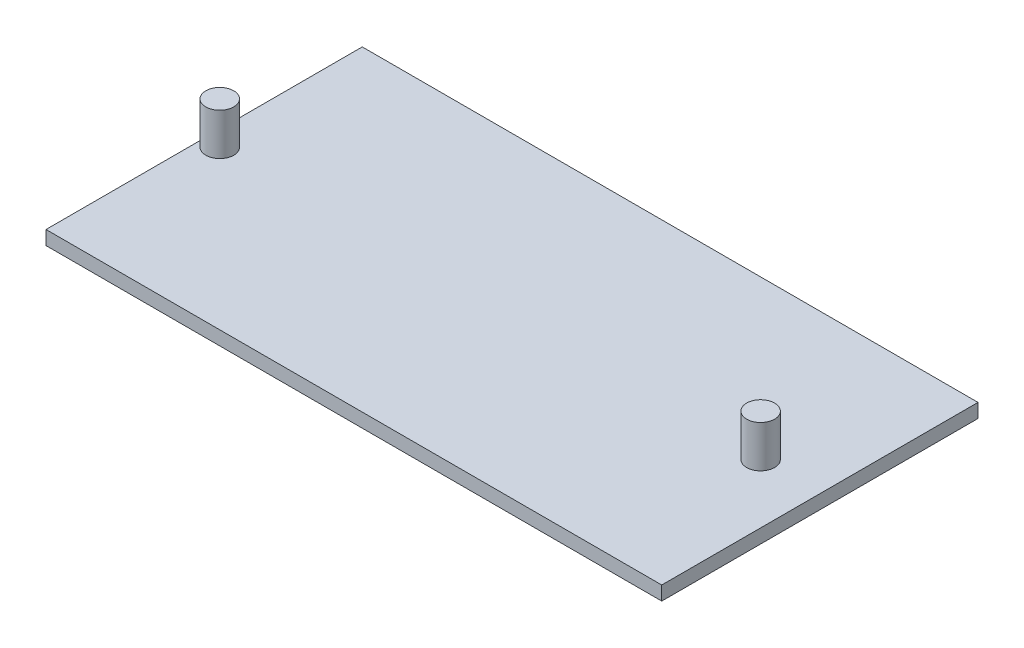
ISO-10303-21;
HEADER;
FILE_DESCRIPTION(('STEP AP214'),'2;1');
FILE_NAME('part.step','',(''),(''),'','','');
FILE_SCHEMA(('AUTOMOTIVE_DESIGN { 1 0 10303 214 1 1 1 1 }'));
ENDSEC;
DATA;
#1=APPLICATION_CONTEXT('core data for automotive mechanical design processes');
#2=APPLICATION_PROTOCOL_DEFINITION('international standard','automotive_design',2000,#1);
#3=PRODUCT_CONTEXT('',#1,'mechanical');
#4=PRODUCT('Part','Part','',(#3));
#5=PRODUCT_RELATED_PRODUCT_CATEGORY('part','',(#4));
#6=PRODUCT_DEFINITION_FORMATION('','',#4);
#7=PRODUCT_DEFINITION_CONTEXT('part definition',#1,'design');
#8=PRODUCT_DEFINITION('design','',#6,#7);
#9=PRODUCT_DEFINITION_SHAPE('','',#8);
#10=(LENGTH_UNIT() NAMED_UNIT(*) SI_UNIT(.MILLI.,.METRE.));
#11=(NAMED_UNIT(*) PLANE_ANGLE_UNIT() SI_UNIT($,.RADIAN.));
#12=(NAMED_UNIT(*) SI_UNIT($,.STERADIAN.) SOLID_ANGLE_UNIT());
#13=UNCERTAINTY_MEASURE_WITH_UNIT(LENGTH_MEASURE(1.E-05),#10,'distance_accuracy_value','');
#14=(GEOMETRIC_REPRESENTATION_CONTEXT(3) GLOBAL_UNCERTAINTY_ASSIGNED_CONTEXT((#13)) GLOBAL_UNIT_ASSIGNED_CONTEXT((#10,
#11,#12)) REPRESENTATION_CONTEXT('',''));
#15=CARTESIAN_POINT('',(0.,0.,0.));
#16=DIRECTION('',(0.,0.,1.));
#17=DIRECTION('',(1.,0.,0.));
#18=AXIS2_PLACEMENT_3D('',#15,#16,#17);
#19=CARTESIAN_POINT('',(6.35,9.525,-35.941));
#20=DIRECTION('',(0.,-1.,0.));
#21=DIRECTION('',(0.,0.,-1.));
#22=AXIS2_PLACEMENT_3D('',#19,#20,#21);
#23=CYLINDRICAL_SURFACE('',#22,3.175);
#24=CARTESIAN_POINT('',(6.35,9.525,-35.941));
#25=DIRECTION('',(0.,-1.,0.));
#26=DIRECTION('',(0.,0.,-1.));
#27=AXIS2_PLACEMENT_3D('',#24,#25,#26);
#28=CIRCLE('',#27,3.175);
#29=CARTESIAN_POINT('',(6.35,9.525,-39.116));
#30=VERTEX_POINT('',#29);
#31=EDGE_CURVE('E11',#30,#30,#28,.T.);
#32=ORIENTED_EDGE('',*,*,#31,.T.);
#33=EDGE_LOOP('',(#32));
#34=FACE_BOUND('',#33,.T.);
#35=CARTESIAN_POINT('',(6.35,0.,-35.941));
#36=DIRECTION('',(0.,-1.,0.));
#37=DIRECTION('',(0.,0.,-1.));
#38=AXIS2_PLACEMENT_3D('',#35,#36,#37);
#39=CIRCLE('',#38,3.175);
#40=CARTESIAN_POINT('',(6.35,0.,-39.116));
#41=VERTEX_POINT('',#40);
#42=EDGE_CURVE('E42',#41,#41,#39,.F.);
#43=ORIENTED_EDGE('',*,*,#42,.T.);
#44=EDGE_LOOP('',(#43));
#45=FACE_BOUND('',#44,.T.);
#46=ADVANCED_FACE('F39',(#34,#45),#23,.T.);
#47=CARTESIAN_POINT('',(6.35,9.525,-35.941));
#48=DIRECTION('',(0.,-1.,0.));
#49=DIRECTION('',(0.,0.,-1.));
#50=AXIS2_PLACEMENT_3D('',#47,#48,#49);
#51=PLANE('',#50);
#52=ORIENTED_EDGE('',*,*,#31,.F.);
#53=EDGE_LOOP('',(#52));
#54=FACE_BOUND('',#53,.T.);
#55=ADVANCED_FACE('F156',(#54),#51,.F.);
#56=CARTESIAN_POINT('',(6.35,0.,-35.941));
#57=DIRECTION('',(0.,-1.,0.));
#58=DIRECTION('',(0.,0.,-1.));
#59=AXIS2_PLACEMENT_3D('',#56,#57,#58);
#60=PLANE('',#59);
#61=ORIENTED_EDGE('',*,*,#42,.F.);
#62=EDGE_LOOP('',(#61));
#63=FACE_BOUND('',#62,.T.);
#64=CARTESIAN_POINT('',(129.286,0.,-35.941));
#65=DIRECTION('',(0.,-1.,0.));
#66=DIRECTION('',(0.,0.,-1.));
#67=AXIS2_PLACEMENT_3D('',#64,#65,#66);
#68=CIRCLE('',#67,3.175);
#69=CARTESIAN_POINT('',(129.286,0.,-39.116));
#70=VERTEX_POINT('',#69);
#71=EDGE_CURVE('E124',#70,#70,#68,.T.);
#72=ORIENTED_EDGE('',*,*,#71,.T.);
#73=EDGE_LOOP('',(#72));
#74=FACE_BOUND('',#73,.T.);
#75=DIRECTION('',(-1.,0.,0.));
#76=VECTOR('',#75,1.);
#77=CARTESIAN_POINT('',(0.,0.,-71.882));
#78=LINE('',#77,#76);
#79=CARTESIAN_POINT('',(142.748,0.,-71.882));
#80=VERTEX_POINT('',#79);
#81=CARTESIAN_POINT('',(2.794,0.,-71.882));
#82=VERTEX_POINT('',#81);
#83=EDGE_CURVE('E89',#80,#82,#78,.T.);
#84=ORIENTED_EDGE('',*,*,#83,.T.);
#85=DIRECTION('',(0.,0.,-1.));
#86=VECTOR('',#85,1.);
#87=CARTESIAN_POINT('',(2.794,0.,-71.882));
#88=LINE('',#87,#86);
#89=CARTESIAN_POINT('',(2.794,0.,0.));
#90=VERTEX_POINT('',#89);
#91=EDGE_CURVE('E59',#90,#82,#88,.T.);
#92=ORIENTED_EDGE('',*,*,#91,.F.);
#93=DIRECTION('',(1.,0.,0.));
#94=VECTOR('',#93,1.);
#95=CARTESIAN_POINT('',(0.,0.,0.));
#96=LINE('',#95,#94);
#97=CARTESIAN_POINT('',(142.748,0.,0.));
#98=VERTEX_POINT('',#97);
#99=EDGE_CURVE('E128',#90,#98,#96,.T.);
#100=ORIENTED_EDGE('',*,*,#99,.T.);
#101=DIRECTION('',(0.,0.,1.));
#102=VECTOR('',#101,1.);
#103=CARTESIAN_POINT('',(142.748,0.,0.));
#104=LINE('',#103,#102);
#105=EDGE_CURVE('E104',#80,#98,#104,.T.);
#106=ORIENTED_EDGE('',*,*,#105,.F.);
#107=EDGE_LOOP('',(#84,#92,#100,#106));
#108=FACE_BOUND('',#107,.T.);
#109=ADVANCED_FACE('F138',(#63,#74,#108),#60,.F.);
#110=CARTESIAN_POINT('',(0.,-3.175,-71.882));
#111=DIRECTION('',(0.,0.,-1.));
#112=DIRECTION('',(-1.,0.,0.));
#113=AXIS2_PLACEMENT_3D('',#110,#111,#112);
#114=PLANE('',#113);
#115=DIRECTION('',(0.,-1.,0.));
#116=VECTOR('',#115,1.);
#117=CARTESIAN_POINT('',(2.794,-3.175,-71.882));
#118=LINE('',#117,#116);
#119=CARTESIAN_POINT('',(2.794,-3.175,-71.882));
#120=VERTEX_POINT('',#119);
#121=EDGE_CURVE('E54',#82,#120,#118,.T.);
#122=ORIENTED_EDGE('',*,*,#121,.F.);
#123=ORIENTED_EDGE('',*,*,#83,.F.);
#124=DIRECTION('',(0.,1.,0.));
#125=VECTOR('',#124,1.);
#126=CARTESIAN_POINT('',(142.748,-3.175,-71.882));
#127=LINE('',#126,#125);
#128=CARTESIAN_POINT('',(142.748,-3.175,-71.882));
#129=VERTEX_POINT('',#128);
#130=EDGE_CURVE('E99',#129,#80,#127,.T.);
#131=ORIENTED_EDGE('',*,*,#130,.F.);
#132=DIRECTION('',(-1.,0.,0.));
#133=VECTOR('',#132,1.);
#134=CARTESIAN_POINT('',(0.,-3.175,-71.882));
#135=LINE('',#134,#133);
#136=EDGE_CURVE('E88',#129,#120,#135,.T.);
#137=ORIENTED_EDGE('',*,*,#136,.T.);
#138=EDGE_LOOP('',(#122,#123,#131,#137));
#139=FACE_BOUND('',#138,.T.);
#140=ADVANCED_FACE('F152',(#139),#114,.T.);
#141=CARTESIAN_POINT('',(0.,-3.175,0.));
#142=DIRECTION('',(0.,0.,1.));
#143=DIRECTION('',(1.,0.,0.));
#144=AXIS2_PLACEMENT_3D('',#141,#142,#143);
#145=PLANE('',#144);
#146=DIRECTION('',(0.,1.,0.));
#147=VECTOR('',#146,1.);
#148=CARTESIAN_POINT('',(2.794,-3.175,0.));
#149=LINE('',#148,#147);
#150=CARTESIAN_POINT('',(2.794,-3.175,0.));
#151=VERTEX_POINT('',#150);
#152=EDGE_CURVE('E85',#151,#90,#149,.T.);
#153=ORIENTED_EDGE('',*,*,#152,.F.);
#154=DIRECTION('',(1.,0.,0.));
#155=VECTOR('',#154,1.);
#156=CARTESIAN_POINT('',(0.,-3.175,0.));
#157=LINE('',#156,#155);
#158=CARTESIAN_POINT('',(142.748,-3.175,0.));
#159=VERTEX_POINT('',#158);
#160=EDGE_CURVE('E79',#151,#159,#157,.T.);
#161=ORIENTED_EDGE('',*,*,#160,.T.);
#162=DIRECTION('',(0.,-1.,0.));
#163=VECTOR('',#162,1.);
#164=CARTESIAN_POINT('',(142.748,-3.175,0.));
#165=LINE('',#164,#163);
#166=EDGE_CURVE('E84',#98,#159,#165,.T.);
#167=ORIENTED_EDGE('',*,*,#166,.F.);
#168=ORIENTED_EDGE('',*,*,#99,.F.);
#169=EDGE_LOOP('',(#153,#161,#167,#168));
#170=FACE_BOUND('',#169,.T.);
#171=ADVANCED_FACE('F81',(#170),#145,.T.);
#172=CARTESIAN_POINT('',(129.286,9.525,-35.941));
#173=DIRECTION('',(0.,-1.,0.));
#174=DIRECTION('',(0.,0.,-1.));
#175=AXIS2_PLACEMENT_3D('',#172,#173,#174);
#176=CYLINDRICAL_SURFACE('',#175,3.175);
#177=CARTESIAN_POINT('',(129.286,9.525,-35.941));
#178=DIRECTION('',(0.,-1.,0.));
#179=DIRECTION('',(0.,0.,-1.));
#180=AXIS2_PLACEMENT_3D('',#177,#178,#179);
#181=CIRCLE('',#180,3.175);
#182=CARTESIAN_POINT('',(129.286,9.525,-39.116));
#183=VERTEX_POINT('',#182);
#184=EDGE_CURVE('E121',#183,#183,#181,.T.);
#185=ORIENTED_EDGE('',*,*,#184,.T.);
#186=EDGE_LOOP('',(#185));
#187=FACE_BOUND('',#186,.T.);
#188=ORIENTED_EDGE('',*,*,#71,.F.);
#189=EDGE_LOOP('',(#188));
#190=FACE_BOUND('',#189,.T.);
#191=ADVANCED_FACE('F141',(#187,#190),#176,.T.);
#192=CARTESIAN_POINT('',(129.286,9.525,-35.941));
#193=DIRECTION('',(0.,-1.,0.));
#194=DIRECTION('',(0.,0.,-1.));
#195=AXIS2_PLACEMENT_3D('',#192,#193,#194);
#196=PLANE('',#195);
#197=ORIENTED_EDGE('',*,*,#184,.F.);
#198=EDGE_LOOP('',(#197));
#199=FACE_BOUND('',#198,.T.);
#200=ADVANCED_FACE('F143',(#199),#196,.F.);
#201=CARTESIAN_POINT('',(6.35,-3.175,-35.941));
#202=DIRECTION('',(0.,-1.,0.));
#203=DIRECTION('',(0.,0.,-1.));
#204=AXIS2_PLACEMENT_3D('',#201,#202,#203);
#205=PLANE('',#204);
#206=DIRECTION('',(0.,0.,1.));
#207=VECTOR('',#206,1.);
#208=CARTESIAN_POINT('',(2.794,-3.175,-71.882));
#209=LINE('',#208,#207);
#210=EDGE_CURVE('E114',#120,#151,#209,.T.);
#211=ORIENTED_EDGE('',*,*,#210,.F.);
#212=ORIENTED_EDGE('',*,*,#136,.F.);
#213=DIRECTION('',(0.,0.,-1.));
#214=VECTOR('',#213,1.);
#215=CARTESIAN_POINT('',(142.748,-3.175,0.));
#216=LINE('',#215,#214);
#217=EDGE_CURVE('E92',#159,#129,#216,.T.);
#218=ORIENTED_EDGE('',*,*,#217,.F.);
#219=ORIENTED_EDGE('',*,*,#160,.F.);
#220=EDGE_LOOP('',(#211,#212,#218,#219));
#221=FACE_BOUND('',#220,.T.);
#222=ADVANCED_FACE('F93',(#221),#205,.T.);
#223=CARTESIAN_POINT('',(2.794,0.,0.));
#224=DIRECTION('',(1.,0.,0.));
#225=DIRECTION('',(0.,0.,-1.));
#226=AXIS2_PLACEMENT_3D('',#223,#224,#225);
#227=PLANE('',#226);
#228=ORIENTED_EDGE('',*,*,#121,.T.);
#229=ORIENTED_EDGE('',*,*,#210,.T.);
#230=ORIENTED_EDGE('',*,*,#152,.T.);
#231=ORIENTED_EDGE('',*,*,#91,.T.);
#232=EDGE_LOOP('',(#228,#229,#230,#231));
#233=FACE_BOUND('',#232,.T.);
#234=ADVANCED_FACE('F176',(#233),#227,.F.);
#235=CARTESIAN_POINT('',(142.748,0.,0.));
#236=DIRECTION('',(-1.,0.,0.));
#237=DIRECTION('',(0.,0.,1.));
#238=AXIS2_PLACEMENT_3D('',#235,#236,#237);
#239=PLANE('',#238);
#240=ORIENTED_EDGE('',*,*,#166,.T.);
#241=ORIENTED_EDGE('',*,*,#217,.T.);
#242=ORIENTED_EDGE('',*,*,#130,.T.);
#243=ORIENTED_EDGE('',*,*,#105,.T.);
#244=EDGE_LOOP('',(#240,#241,#242,#243));
#245=FACE_BOUND('',#244,.T.);
#246=ADVANCED_FACE('F102',(#245),#239,.F.);
#247=CLOSED_SHELL('',(#46,#55,#109,#140,#171,#191,#200,#222,#234,#246));
#248=MANIFOLD_SOLID_BREP('B2',#247);
#249=ADVANCED_BREP_SHAPE_REPRESENTATION('',(#18,#248),#14);
#250=SHAPE_DEFINITION_REPRESENTATION(#9,#249);
ENDSEC;
END-ISO-10303-21;
